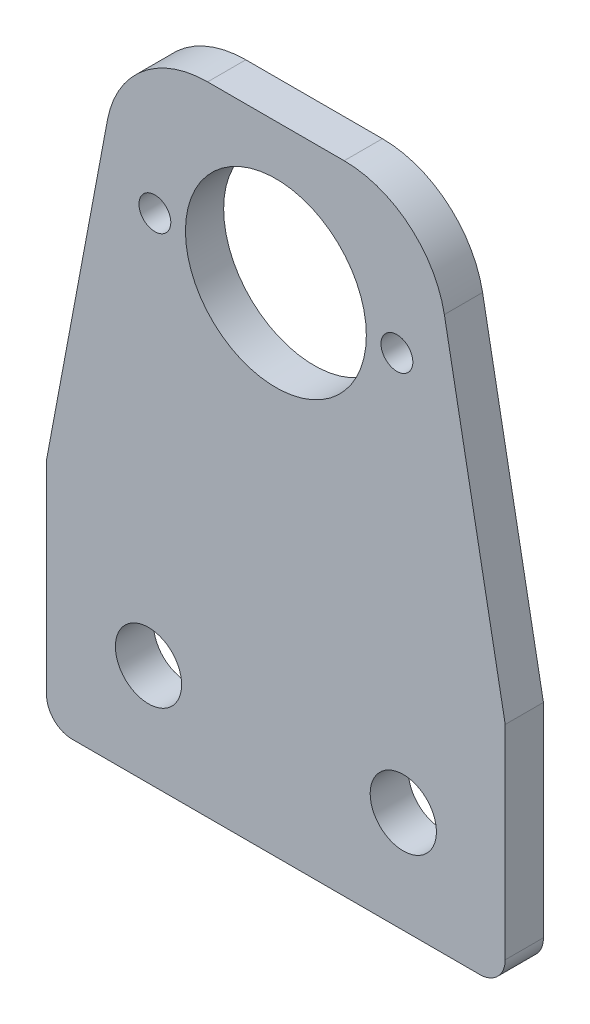
ISO-10303-21;
HEADER;
FILE_DESCRIPTION(('STEP AP214'),'2;1');
FILE_NAME('part.step','',(''),(''),'','','');
FILE_SCHEMA(('AUTOMOTIVE_DESIGN { 1 0 10303 214 1 1 1 1 }'));
ENDSEC;
DATA;
#1=APPLICATION_CONTEXT('core data for automotive mechanical design processes');
#2=APPLICATION_PROTOCOL_DEFINITION('international standard','automotive_design',2000,#1);
#3=PRODUCT_CONTEXT('',#1,'mechanical');
#4=PRODUCT('Part','Part','',(#3));
#5=PRODUCT_RELATED_PRODUCT_CATEGORY('part','',(#4));
#6=PRODUCT_DEFINITION_FORMATION('','',#4);
#7=PRODUCT_DEFINITION_CONTEXT('part definition',#1,'design');
#8=PRODUCT_DEFINITION('design','',#6,#7);
#9=PRODUCT_DEFINITION_SHAPE('','',#8);
#10=(LENGTH_UNIT() NAMED_UNIT(*) SI_UNIT(.MILLI.,.METRE.));
#11=(NAMED_UNIT(*) PLANE_ANGLE_UNIT() SI_UNIT($,.RADIAN.));
#12=(NAMED_UNIT(*) SI_UNIT($,.STERADIAN.) SOLID_ANGLE_UNIT());
#13=UNCERTAINTY_MEASURE_WITH_UNIT(LENGTH_MEASURE(1.E-05),#10,'distance_accuracy_value','');
#14=(GEOMETRIC_REPRESENTATION_CONTEXT(3) GLOBAL_UNCERTAINTY_ASSIGNED_CONTEXT((#13)) GLOBAL_UNIT_ASSIGNED_CONTEXT((#10,
#11,#12)) REPRESENTATION_CONTEXT('',''));
#15=CARTESIAN_POINT('',(0.,0.,0.));
#16=DIRECTION('',(0.,0.,1.));
#17=DIRECTION('',(1.,0.,0.));
#18=AXIS2_PLACEMENT_3D('',#15,#16,#17);
#19=CARTESIAN_POINT('',(-18.,0.,-3.));
#20=DIRECTION('',(-1.,0.,0.));
#21=DIRECTION('',(0.,0.,1.));
#22=AXIS2_PLACEMENT_3D('',#19,#20,#21);
#23=PLANE('',#22);
#24=DIRECTION('',(0.,-1.,0.));
#25=VECTOR('',#24,1.);
#26=CARTESIAN_POINT('',(-18.,0.,-3.));
#27=LINE('',#26,#25);
#28=CARTESIAN_POINT('',(-18.,18.,-3.));
#29=VERTEX_POINT('',#28);
#30=CARTESIAN_POINT('',(-18.,2.,-3.));
#31=VERTEX_POINT('',#30);
#32=EDGE_CURVE('E139',#29,#31,#27,.T.);
#33=ORIENTED_EDGE('',*,*,#32,.T.);
#34=DIRECTION('',(0.,0.,1.));
#35=VECTOR('',#34,1.);
#36=CARTESIAN_POINT('',(-18.,2.,-3.));
#37=LINE('',#36,#35);
#38=CARTESIAN_POINT('',(-18.,2.,0.));
#39=VERTEX_POINT('',#38);
#40=EDGE_CURVE('E160',#31,#39,#37,.T.);
#41=ORIENTED_EDGE('',*,*,#40,.T.);
#42=DIRECTION('',(0.,-1.,0.));
#43=VECTOR('',#42,1.);
#44=CARTESIAN_POINT('',(-18.,0.,0.));
#45=LINE('',#44,#43);
#46=CARTESIAN_POINT('',(-18.,18.,0.));
#47=VERTEX_POINT('',#46);
#48=EDGE_CURVE('E123',#47,#39,#45,.T.);
#49=ORIENTED_EDGE('',*,*,#48,.F.);
#50=DIRECTION('',(0.,0.,1.));
#51=VECTOR('',#50,1.);
#52=CARTESIAN_POINT('',(-18.,18.,-3.));
#53=LINE('',#52,#51);
#54=EDGE_CURVE('E111',#29,#47,#53,.T.);
#55=ORIENTED_EDGE('',*,*,#54,.F.);
#56=EDGE_LOOP('',(#33,#41,#49,#55));
#57=FACE_BOUND('',#56,.T.);
#58=ADVANCED_FACE('F17',(#57),#23,.T.);
#59=CARTESIAN_POINT('',(-12.,50.,-3.));
#60=DIRECTION('',(-0.982872186934322,0.184288535050185,0.));
#61=DIRECTION('',(-0.184288535050185,-0.982872186934322,0.));
#62=AXIS2_PLACEMENT_3D('',#59,#60,#61);
#63=PLANE('',#62);
#64=DIRECTION('',(-0.184288535050185,-0.982872186934322,0.));
#65=VECTOR('',#64,1.);
#66=CARTESIAN_POINT('',(-12.,50.,0.));
#67=LINE('',#66,#65);
#68=CARTESIAN_POINT('',(-13.2235671974247,43.4743082804015,0.));
#69=VERTEX_POINT('',#68);
#70=EDGE_CURVE('E138',#69,#47,#67,.T.);
#71=ORIENTED_EDGE('',*,*,#70,.F.);
#72=DIRECTION('',(0.,0.,1.));
#73=VECTOR('',#72,1.);
#74=CARTESIAN_POINT('',(-13.2235671974247,43.4743082804015,-3.));
#75=LINE('',#74,#73);
#76=CARTESIAN_POINT('',(-13.2235671974247,43.4743082804015,-3.));
#77=VERTEX_POINT('',#76);
#78=EDGE_CURVE('E37',#69,#77,#75,.F.);
#79=ORIENTED_EDGE('',*,*,#78,.T.);
#80=DIRECTION('',(-0.184288535050185,-0.982872186934322,0.));
#81=VECTOR('',#80,1.);
#82=CARTESIAN_POINT('',(-12.,50.,-3.));
#83=LINE('',#82,#81);
#84=EDGE_CURVE('E113',#77,#29,#83,.T.);
#85=ORIENTED_EDGE('',*,*,#84,.T.);
#86=ORIENTED_EDGE('',*,*,#54,.T.);
#87=EDGE_LOOP('',(#71,#79,#85,#86));
#88=FACE_BOUND('',#87,.T.);
#89=ADVANCED_FACE('F185',(#88),#63,.T.);
#90=CARTESIAN_POINT('',(-12.,50.,-3.));
#91=DIRECTION('',(0.,1.,0.));
#92=DIRECTION('',(0.,0.,1.));
#93=AXIS2_PLACEMENT_3D('',#90,#91,#92);
#94=PLANE('',#93);
#95=DIRECTION('',(-1.,0.,0.));
#96=VECTOR('',#95,1.);
#97=CARTESIAN_POINT('',(-12.,50.,-3.));
#98=LINE('',#97,#96);
#99=CARTESIAN_POINT('',(5.36058970195015,50.,-3.));
#100=VERTEX_POINT('',#99);
#101=CARTESIAN_POINT('',(-5.36058970195015,50.,-3.));
#102=VERTEX_POINT('',#101);
#103=EDGE_CURVE('E119',#100,#102,#98,.T.);
#104=ORIENTED_EDGE('',*,*,#103,.T.);
#105=DIRECTION('',(0.,0.,1.));
#106=VECTOR('',#105,1.);
#107=CARTESIAN_POINT('',(-5.36058970195015,50.,-3.));
#108=LINE('',#107,#106);
#109=CARTESIAN_POINT('',(-5.36058970195015,50.,0.));
#110=VERTEX_POINT('',#109);
#111=EDGE_CURVE('E165',#102,#110,#108,.T.);
#112=ORIENTED_EDGE('',*,*,#111,.T.);
#113=DIRECTION('',(-1.,0.,0.));
#114=VECTOR('',#113,1.);
#115=CARTESIAN_POINT('',(-12.,50.,0.));
#116=LINE('',#115,#114);
#117=CARTESIAN_POINT('',(5.36058970195015,50.,0.));
#118=VERTEX_POINT('',#117);
#119=EDGE_CURVE('E134',#118,#110,#116,.T.);
#120=ORIENTED_EDGE('',*,*,#119,.F.);
#121=DIRECTION('',(0.,0.,1.));
#122=VECTOR('',#121,1.);
#123=CARTESIAN_POINT('',(5.36058970195015,50.,-3.));
#124=LINE('',#123,#122);
#125=EDGE_CURVE('E159',#118,#100,#124,.F.);
#126=ORIENTED_EDGE('',*,*,#125,.T.);
#127=EDGE_LOOP('',(#104,#112,#120,#126));
#128=FACE_BOUND('',#127,.T.);
#129=ADVANCED_FACE('F175',(#128),#94,.T.);
#130=CARTESIAN_POINT('',(12.,50.,-3.));
#131=DIRECTION('',(0.982872186934322,0.184288535050185,0.));
#132=DIRECTION('',(-0.184288535050185,0.982872186934322,0.));
#133=AXIS2_PLACEMENT_3D('',#130,#131,#132);
#134=PLANE('',#133);
#135=DIRECTION('',(-0.184288535050185,0.982872186934322,0.));
#136=VECTOR('',#135,1.);
#137=CARTESIAN_POINT('',(12.,50.,-3.));
#138=LINE('',#137,#136);
#139=CARTESIAN_POINT('',(18.,18.,-3.));
#140=VERTEX_POINT('',#139);
#141=CARTESIAN_POINT('',(13.2235671974247,43.4743082804015,-3.));
#142=VERTEX_POINT('',#141);
#143=EDGE_CURVE('E106',#140,#142,#138,.T.);
#144=ORIENTED_EDGE('',*,*,#143,.T.);
#145=DIRECTION('',(0.,0.,1.));
#146=VECTOR('',#145,1.);
#147=CARTESIAN_POINT('',(13.2235671974247,43.4743082804015,-3.));
#148=LINE('',#147,#146);
#149=CARTESIAN_POINT('',(13.2235671974247,43.4743082804015,0.));
#150=VERTEX_POINT('',#149);
#151=EDGE_CURVE('E11',#142,#150,#148,.T.);
#152=ORIENTED_EDGE('',*,*,#151,.T.);
#153=DIRECTION('',(-0.184288535050185,0.982872186934322,0.));
#154=VECTOR('',#153,1.);
#155=CARTESIAN_POINT('',(12.,50.,0.));
#156=LINE('',#155,#154);
#157=CARTESIAN_POINT('',(18.,18.,0.));
#158=VERTEX_POINT('',#157);
#159=EDGE_CURVE('E114',#158,#150,#156,.T.);
#160=ORIENTED_EDGE('',*,*,#159,.F.);
#161=DIRECTION('',(0.,0.,1.));
#162=VECTOR('',#161,1.);
#163=CARTESIAN_POINT('',(18.,18.,-3.));
#164=LINE('',#163,#162);
#165=EDGE_CURVE('E101',#140,#158,#164,.T.);
#166=ORIENTED_EDGE('',*,*,#165,.F.);
#167=EDGE_LOOP('',(#144,#152,#160,#166));
#168=FACE_BOUND('',#167,.T.);
#169=ADVANCED_FACE('F109',(#168),#134,.T.);
#170=CARTESIAN_POINT('',(18.,18.,-3.));
#171=DIRECTION('',(1.,0.,0.));
#172=DIRECTION('',(0.,0.,-1.));
#173=AXIS2_PLACEMENT_3D('',#170,#171,#172);
#174=PLANE('',#173);
#175=DIRECTION('',(0.,1.,0.));
#176=VECTOR('',#175,1.);
#177=CARTESIAN_POINT('',(18.,18.,0.));
#178=LINE('',#177,#176);
#179=CARTESIAN_POINT('',(18.,2.,0.));
#180=VERTEX_POINT('',#179);
#181=EDGE_CURVE('E135',#180,#158,#178,.T.);
#182=ORIENTED_EDGE('',*,*,#181,.F.);
#183=DIRECTION('',(0.,0.,1.));
#184=VECTOR('',#183,1.);
#185=CARTESIAN_POINT('',(18.,2.,-3.));
#186=LINE('',#185,#184);
#187=CARTESIAN_POINT('',(18.,2.,-3.));
#188=VERTEX_POINT('',#187);
#189=EDGE_CURVE('E102',#180,#188,#186,.F.);
#190=ORIENTED_EDGE('',*,*,#189,.T.);
#191=DIRECTION('',(0.,1.,0.));
#192=VECTOR('',#191,1.);
#193=CARTESIAN_POINT('',(18.,18.,-3.));
#194=LINE('',#193,#192);
#195=EDGE_CURVE('E100',#188,#140,#194,.T.);
#196=ORIENTED_EDGE('',*,*,#195,.T.);
#197=ORIENTED_EDGE('',*,*,#165,.T.);
#198=EDGE_LOOP('',(#182,#190,#196,#197));
#199=FACE_BOUND('',#198,.T.);
#200=ADVANCED_FACE('F99',(#199),#174,.T.);
#201=CARTESIAN_POINT('',(-18.,0.,-3.));
#202=DIRECTION('',(0.,-1.,0.));
#203=DIRECTION('',(0.,0.,-1.));
#204=AXIS2_PLACEMENT_3D('',#201,#202,#203);
#205=PLANE('',#204);
#206=DIRECTION('',(1.,0.,0.));
#207=VECTOR('',#206,1.);
#208=CARTESIAN_POINT('',(-18.,0.,-3.));
#209=LINE('',#208,#207);
#210=CARTESIAN_POINT('',(-16.,0.,-3.));
#211=VERTEX_POINT('',#210);
#212=CARTESIAN_POINT('',(16.,0.,-3.));
#213=VERTEX_POINT('',#212);
#214=EDGE_CURVE('E110',#211,#213,#209,.T.);
#215=ORIENTED_EDGE('',*,*,#214,.T.);
#216=DIRECTION('',(0.,0.,1.));
#217=VECTOR('',#216,1.);
#218=CARTESIAN_POINT('',(16.,0.,-3.));
#219=LINE('',#218,#217);
#220=CARTESIAN_POINT('',(16.,0.,0.));
#221=VERTEX_POINT('',#220);
#222=EDGE_CURVE('E144',#213,#221,#219,.T.);
#223=ORIENTED_EDGE('',*,*,#222,.T.);
#224=DIRECTION('',(1.,0.,0.));
#225=VECTOR('',#224,1.);
#226=CARTESIAN_POINT('',(-18.,0.,0.));
#227=LINE('',#226,#225);
#228=CARTESIAN_POINT('',(-16.,0.,0.));
#229=VERTEX_POINT('',#228);
#230=EDGE_CURVE('E128',#229,#221,#227,.T.);
#231=ORIENTED_EDGE('',*,*,#230,.F.);
#232=DIRECTION('',(0.,0.,1.));
#233=VECTOR('',#232,1.);
#234=CARTESIAN_POINT('',(-16.,0.,-3.));
#235=LINE('',#234,#233);
#236=EDGE_CURVE('E142',#229,#211,#235,.F.);
#237=ORIENTED_EDGE('',*,*,#236,.T.);
#238=EDGE_LOOP('',(#215,#223,#231,#237));
#239=FACE_BOUND('',#238,.T.);
#240=ADVANCED_FACE('F195',(#239),#205,.T.);
#241=CARTESIAN_POINT('',(0.,0.,-3.));
#242=DIRECTION('',(0.,0.,-1.));
#243=DIRECTION('',(-1.,0.,0.));
#244=AXIS2_PLACEMENT_3D('',#241,#242,#243);
#245=PLANE('',#244);
#246=CARTESIAN_POINT('',(-9.5,39.,-3.));
#247=DIRECTION('',(0.,0.,1.));
#248=DIRECTION('',(-1.,0.,0.));
#249=AXIS2_PLACEMENT_3D('',#246,#247,#248);
#250=CIRCLE('',#249,1.25);
#251=CARTESIAN_POINT('',(-10.75,39.,-3.));
#252=VERTEX_POINT('',#251);
#253=EDGE_CURVE('E219',#252,#252,#250,.T.);
#254=ORIENTED_EDGE('',*,*,#253,.T.);
#255=EDGE_LOOP('',(#254));
#256=FACE_BOUND('',#255,.T.);
#257=CARTESIAN_POINT('',(9.5,39.,-3.));
#258=DIRECTION('',(0.,0.,1.));
#259=DIRECTION('',(1.,0.,0.));
#260=AXIS2_PLACEMENT_3D('',#257,#258,#259);
#261=CIRCLE('',#260,1.25);
#262=CARTESIAN_POINT('',(10.75,39.,-3.));
#263=VERTEX_POINT('',#262);
#264=EDGE_CURVE('E212',#263,#263,#261,.T.);
#265=ORIENTED_EDGE('',*,*,#264,.T.);
#266=EDGE_LOOP('',(#265));
#267=FACE_BOUND('',#266,.T.);
#268=CARTESIAN_POINT('',(0.,39.,-3.));
#269=DIRECTION('',(0.,0.,1.));
#270=DIRECTION('',(1.,0.,0.));
#271=AXIS2_PLACEMENT_3D('',#268,#269,#270);
#272=CIRCLE('',#271,7.1);
#273=CARTESIAN_POINT('',(7.1,39.,-3.));
#274=VERTEX_POINT('',#273);
#275=EDGE_CURVE('E208',#274,#274,#272,.T.);
#276=ORIENTED_EDGE('',*,*,#275,.T.);
#277=EDGE_LOOP('',(#276));
#278=FACE_BOUND('',#277,.T.);
#279=CARTESIAN_POINT('',(10.,8.,-3.));
#280=DIRECTION('',(0.,0.,1.));
#281=DIRECTION('',(-1.,0.,0.));
#282=AXIS2_PLACEMENT_3D('',#279,#280,#281);
#283=CIRCLE('',#282,2.6);
#284=CARTESIAN_POINT('',(7.4,8.,-3.));
#285=VERTEX_POINT('',#284);
#286=EDGE_CURVE('E205',#285,#285,#283,.T.);
#287=ORIENTED_EDGE('',*,*,#286,.T.);
#288=EDGE_LOOP('',(#287));
#289=FACE_BOUND('',#288,.T.);
#290=CARTESIAN_POINT('',(-10.,8.,-3.));
#291=DIRECTION('',(0.,0.,1.));
#292=DIRECTION('',(1.,0.,0.));
#293=AXIS2_PLACEMENT_3D('',#290,#291,#292);
#294=CIRCLE('',#293,2.6);
#295=CARTESIAN_POINT('',(-7.4,8.,-3.));
#296=VERTEX_POINT('',#295);
#297=EDGE_CURVE('E127',#296,#296,#294,.T.);
#298=ORIENTED_EDGE('',*,*,#297,.T.);
#299=EDGE_LOOP('',(#298));
#300=FACE_BOUND('',#299,.T.);
#301=ORIENTED_EDGE('',*,*,#84,.F.);
#302=CARTESIAN_POINT('',(-5.36058970195015,42.,-3.));
#303=DIRECTION('',(0.,0.,-1.));
#304=DIRECTION('',(-1.,0.,0.));
#305=AXIS2_PLACEMENT_3D('',#302,#303,#304);
#306=CIRCLE('',#305,8.);
#307=EDGE_CURVE('E25',#77,#102,#306,.T.);
#308=ORIENTED_EDGE('',*,*,#307,.T.);
#309=ORIENTED_EDGE('',*,*,#103,.F.);
#310=CARTESIAN_POINT('',(5.36058970195015,42.,-3.));
#311=DIRECTION('',(0.,0.,-1.));
#312=DIRECTION('',(-1.,0.,0.));
#313=AXIS2_PLACEMENT_3D('',#310,#311,#312);
#314=CIRCLE('',#313,8.);
#315=EDGE_CURVE('E32',#100,#142,#314,.T.);
#316=ORIENTED_EDGE('',*,*,#315,.T.);
#317=ORIENTED_EDGE('',*,*,#143,.F.);
#318=ORIENTED_EDGE('',*,*,#195,.F.);
#319=CARTESIAN_POINT('',(16.,2.,-3.));
#320=DIRECTION('',(0.,0.,-1.));
#321=DIRECTION('',(-1.,0.,0.));
#322=AXIS2_PLACEMENT_3D('',#319,#320,#321);
#323=CIRCLE('',#322,2.);
#324=EDGE_CURVE('E154',#188,#213,#323,.T.);
#325=ORIENTED_EDGE('',*,*,#324,.T.);
#326=ORIENTED_EDGE('',*,*,#214,.F.);
#327=CARTESIAN_POINT('',(-16.,2.,-3.));
#328=DIRECTION('',(0.,0.,-1.));
#329=DIRECTION('',(-1.,0.,0.));
#330=AXIS2_PLACEMENT_3D('',#327,#328,#329);
#331=CIRCLE('',#330,2.);
#332=EDGE_CURVE('E153',#211,#31,#331,.T.);
#333=ORIENTED_EDGE('',*,*,#332,.T.);
#334=ORIENTED_EDGE('',*,*,#32,.F.);
#335=EDGE_LOOP('',(#301,#308,#309,#316,#317,#318,#325,#326,#333,#334));
#336=FACE_BOUND('',#335,.T.);
#337=ADVANCED_FACE('F117',(#256,#267,#278,#289,#300,#336),#245,.T.);
#338=CARTESIAN_POINT('',(0.,0.,0.));
#339=DIRECTION('',(0.,0.,-1.));
#340=DIRECTION('',(-1.,0.,0.));
#341=AXIS2_PLACEMENT_3D('',#338,#339,#340);
#342=PLANE('',#341);
#343=CARTESIAN_POINT('',(-9.5,39.,0.));
#344=DIRECTION('',(0.,0.,1.));
#345=DIRECTION('',(-1.,0.,0.));
#346=AXIS2_PLACEMENT_3D('',#343,#344,#345);
#347=CIRCLE('',#346,1.25);
#348=CARTESIAN_POINT('',(-10.75,39.,0.));
#349=VERTEX_POINT('',#348);
#350=EDGE_CURVE('E224',#349,#349,#347,.T.);
#351=ORIENTED_EDGE('',*,*,#350,.F.);
#352=EDGE_LOOP('',(#351));
#353=FACE_BOUND('',#352,.T.);
#354=CARTESIAN_POINT('',(9.5,39.,0.));
#355=DIRECTION('',(0.,0.,1.));
#356=DIRECTION('',(1.,0.,0.));
#357=AXIS2_PLACEMENT_3D('',#354,#355,#356);
#358=CIRCLE('',#357,1.25);
#359=CARTESIAN_POINT('',(10.75,39.,0.));
#360=VERTEX_POINT('',#359);
#361=EDGE_CURVE('E220',#360,#360,#358,.T.);
#362=ORIENTED_EDGE('',*,*,#361,.F.);
#363=EDGE_LOOP('',(#362));
#364=FACE_BOUND('',#363,.T.);
#365=CARTESIAN_POINT('',(0.,39.,0.));
#366=DIRECTION('',(0.,0.,1.));
#367=DIRECTION('',(1.,0.,0.));
#368=AXIS2_PLACEMENT_3D('',#365,#366,#367);
#369=CIRCLE('',#368,7.1);
#370=CARTESIAN_POINT('',(7.1,39.,0.));
#371=VERTEX_POINT('',#370);
#372=EDGE_CURVE('E211',#371,#371,#369,.T.);
#373=ORIENTED_EDGE('',*,*,#372,.F.);
#374=EDGE_LOOP('',(#373));
#375=FACE_BOUND('',#374,.T.);
#376=CARTESIAN_POINT('',(10.,8.,0.));
#377=DIRECTION('',(0.,0.,1.));
#378=DIRECTION('',(-1.,0.,0.));
#379=AXIS2_PLACEMENT_3D('',#376,#377,#378);
#380=CIRCLE('',#379,2.6);
#381=CARTESIAN_POINT('',(7.4,8.,0.));
#382=VERTEX_POINT('',#381);
#383=EDGE_CURVE('E202',#382,#382,#380,.T.);
#384=ORIENTED_EDGE('',*,*,#383,.F.);
#385=EDGE_LOOP('',(#384));
#386=FACE_BOUND('',#385,.T.);
#387=CARTESIAN_POINT('',(-10.,8.,0.));
#388=DIRECTION('',(0.,0.,1.));
#389=DIRECTION('',(1.,0.,0.));
#390=AXIS2_PLACEMENT_3D('',#387,#388,#389);
#391=CIRCLE('',#390,2.6);
#392=CARTESIAN_POINT('',(-7.4,8.,0.));
#393=VERTEX_POINT('',#392);
#394=EDGE_CURVE('E200',#393,#393,#391,.T.);
#395=ORIENTED_EDGE('',*,*,#394,.F.);
#396=EDGE_LOOP('',(#395));
#397=FACE_BOUND('',#396,.T.);
#398=ORIENTED_EDGE('',*,*,#119,.T.);
#399=CARTESIAN_POINT('',(-5.36058970195015,42.,0.));
#400=DIRECTION('',(0.,0.,-1.));
#401=DIRECTION('',(-1.,0.,0.));
#402=AXIS2_PLACEMENT_3D('',#399,#400,#401);
#403=CIRCLE('',#402,8.);
#404=EDGE_CURVE('E170',#110,#69,#403,.F.);
#405=ORIENTED_EDGE('',*,*,#404,.T.);
#406=ORIENTED_EDGE('',*,*,#70,.T.);
#407=ORIENTED_EDGE('',*,*,#48,.T.);
#408=CARTESIAN_POINT('',(-16.,2.,0.));
#409=DIRECTION('',(0.,0.,-1.));
#410=DIRECTION('',(-1.,0.,0.));
#411=AXIS2_PLACEMENT_3D('',#408,#409,#410);
#412=CIRCLE('',#411,2.);
#413=EDGE_CURVE('E146',#39,#229,#412,.F.);
#414=ORIENTED_EDGE('',*,*,#413,.T.);
#415=ORIENTED_EDGE('',*,*,#230,.T.);
#416=CARTESIAN_POINT('',(16.,2.,0.));
#417=DIRECTION('',(0.,0.,-1.));
#418=DIRECTION('',(-1.,0.,0.));
#419=AXIS2_PLACEMENT_3D('',#416,#417,#418);
#420=CIRCLE('',#419,2.);
#421=EDGE_CURVE('E147',#221,#180,#420,.F.);
#422=ORIENTED_EDGE('',*,*,#421,.T.);
#423=ORIENTED_EDGE('',*,*,#181,.T.);
#424=ORIENTED_EDGE('',*,*,#159,.T.);
#425=CARTESIAN_POINT('',(5.36058970195015,42.,0.));
#426=DIRECTION('',(0.,0.,-1.));
#427=DIRECTION('',(-1.,0.,0.));
#428=AXIS2_PLACEMENT_3D('',#425,#426,#427);
#429=CIRCLE('',#428,8.);
#430=EDGE_CURVE('E164',#150,#118,#429,.F.);
#431=ORIENTED_EDGE('',*,*,#430,.T.);
#432=EDGE_LOOP('',(#398,#405,#406,#407,#414,#415,#422,#423,#424,#431));
#433=FACE_BOUND('',#432,.T.);
#434=ADVANCED_FACE('F178',(#353,#364,#375,#386,#397,#433),#342,.F.);
#435=CARTESIAN_POINT('',(-10.,8.,-3.));
#436=DIRECTION('',(0.,0.,1.));
#437=DIRECTION('',(1.,0.,0.));
#438=AXIS2_PLACEMENT_3D('',#435,#436,#437);
#439=CYLINDRICAL_SURFACE('',#438,2.6);
#440=ORIENTED_EDGE('',*,*,#297,.F.);
#441=EDGE_LOOP('',(#440));
#442=FACE_BOUND('',#441,.T.);
#443=ORIENTED_EDGE('',*,*,#394,.T.);
#444=EDGE_LOOP('',(#443));
#445=FACE_BOUND('',#444,.T.);
#446=ADVANCED_FACE('F239',(#442,#445),#439,.F.);
#447=CARTESIAN_POINT('',(10.,8.,-3.));
#448=DIRECTION('',(0.,0.,1.));
#449=DIRECTION('',(1.,0.,0.));
#450=AXIS2_PLACEMENT_3D('',#447,#448,#449);
#451=CYLINDRICAL_SURFACE('',#450,2.6);
#452=ORIENTED_EDGE('',*,*,#286,.F.);
#453=EDGE_LOOP('',(#452));
#454=FACE_BOUND('',#453,.T.);
#455=ORIENTED_EDGE('',*,*,#383,.T.);
#456=EDGE_LOOP('',(#455));
#457=FACE_BOUND('',#456,.T.);
#458=ADVANCED_FACE('F253',(#454,#457),#451,.F.);
#459=CARTESIAN_POINT('',(0.,39.,-3.));
#460=DIRECTION('',(0.,0.,1.));
#461=DIRECTION('',(1.,0.,0.));
#462=AXIS2_PLACEMENT_3D('',#459,#460,#461);
#463=CYLINDRICAL_SURFACE('',#462,7.1);
#464=ORIENTED_EDGE('',*,*,#275,.F.);
#465=EDGE_LOOP('',(#464));
#466=FACE_BOUND('',#465,.T.);
#467=ORIENTED_EDGE('',*,*,#372,.T.);
#468=EDGE_LOOP('',(#467));
#469=FACE_BOUND('',#468,.T.);
#470=ADVANCED_FACE('F259',(#466,#469),#463,.F.);
#471=CARTESIAN_POINT('',(16.,2.,-3.));
#472=DIRECTION('',(0.,0.,1.));
#473=DIRECTION('',(1.,0.,0.));
#474=AXIS2_PLACEMENT_3D('',#471,#472,#473);
#475=CYLINDRICAL_SURFACE('',#474,2.);
#476=ORIENTED_EDGE('',*,*,#324,.F.);
#477=ORIENTED_EDGE('',*,*,#189,.F.);
#478=ORIENTED_EDGE('',*,*,#421,.F.);
#479=ORIENTED_EDGE('',*,*,#222,.F.);
#480=EDGE_LOOP('',(#476,#477,#478,#479));
#481=FACE_BOUND('',#480,.T.);
#482=ADVANCED_FACE('F273',(#481),#475,.T.);
#483=CARTESIAN_POINT('',(-16.,2.,-3.));
#484=DIRECTION('',(0.,0.,1.));
#485=DIRECTION('',(1.,0.,0.));
#486=AXIS2_PLACEMENT_3D('',#483,#484,#485);
#487=CYLINDRICAL_SURFACE('',#486,2.);
#488=ORIENTED_EDGE('',*,*,#332,.F.);
#489=ORIENTED_EDGE('',*,*,#236,.F.);
#490=ORIENTED_EDGE('',*,*,#413,.F.);
#491=ORIENTED_EDGE('',*,*,#40,.F.);
#492=EDGE_LOOP('',(#488,#489,#490,#491));
#493=FACE_BOUND('',#492,.T.);
#494=ADVANCED_FACE('F198',(#493),#487,.T.);
#495=CARTESIAN_POINT('',(-5.36058970195015,42.,-3.));
#496=DIRECTION('',(0.,0.,1.));
#497=DIRECTION('',(1.,0.,0.));
#498=AXIS2_PLACEMENT_3D('',#495,#496,#497);
#499=CYLINDRICAL_SURFACE('',#498,8.);
#500=ORIENTED_EDGE('',*,*,#307,.F.);
#501=ORIENTED_EDGE('',*,*,#78,.F.);
#502=ORIENTED_EDGE('',*,*,#404,.F.);
#503=ORIENTED_EDGE('',*,*,#111,.F.);
#504=EDGE_LOOP('',(#500,#501,#502,#503));
#505=FACE_BOUND('',#504,.T.);
#506=ADVANCED_FACE('F179',(#505),#499,.T.);
#507=CARTESIAN_POINT('',(5.36058970195015,42.,-3.));
#508=DIRECTION('',(0.,0.,1.));
#509=DIRECTION('',(1.,0.,0.));
#510=AXIS2_PLACEMENT_3D('',#507,#508,#509);
#511=CYLINDRICAL_SURFACE('',#510,8.);
#512=ORIENTED_EDGE('',*,*,#315,.F.);
#513=ORIENTED_EDGE('',*,*,#125,.F.);
#514=ORIENTED_EDGE('',*,*,#430,.F.);
#515=ORIENTED_EDGE('',*,*,#151,.F.);
#516=EDGE_LOOP('',(#512,#513,#514,#515));
#517=FACE_BOUND('',#516,.T.);
#518=ADVANCED_FACE('F19',(#517),#511,.T.);
#519=CARTESIAN_POINT('',(9.5,39.,-3.));
#520=DIRECTION('',(0.,0.,1.));
#521=DIRECTION('',(1.,0.,0.));
#522=AXIS2_PLACEMENT_3D('',#519,#520,#521);
#523=CYLINDRICAL_SURFACE('',#522,1.25);
#524=ORIENTED_EDGE('',*,*,#264,.F.);
#525=EDGE_LOOP('',(#524));
#526=FACE_BOUND('',#525,.T.);
#527=ORIENTED_EDGE('',*,*,#361,.T.);
#528=EDGE_LOOP('',(#527));
#529=FACE_BOUND('',#528,.T.);
#530=ADVANCED_FACE('F231',(#526,#529),#523,.F.);
#531=CARTESIAN_POINT('',(-9.5,39.,-3.));
#532=DIRECTION('',(0.,0.,1.));
#533=DIRECTION('',(1.,0.,0.));
#534=AXIS2_PLACEMENT_3D('',#531,#532,#533);
#535=CYLINDRICAL_SURFACE('',#534,1.25);
#536=ORIENTED_EDGE('',*,*,#253,.F.);
#537=EDGE_LOOP('',(#536));
#538=FACE_BOUND('',#537,.T.);
#539=ORIENTED_EDGE('',*,*,#350,.T.);
#540=EDGE_LOOP('',(#539));
#541=FACE_BOUND('',#540,.T.);
#542=ADVANCED_FACE('F232',(#538,#541),#535,.F.);
#543=CLOSED_SHELL('',(#58,#89,#129,#169,#200,#240,#337,#434,#446,#458,#470,#482,#494,#506,#518,
#530,#542));
#544=MANIFOLD_SOLID_BREP('B1',#543);
#545=ADVANCED_BREP_SHAPE_REPRESENTATION('',(#18,#544),#14);
#546=SHAPE_DEFINITION_REPRESENTATION(#9,#545);
ENDSEC;
END-ISO-10303-21;
